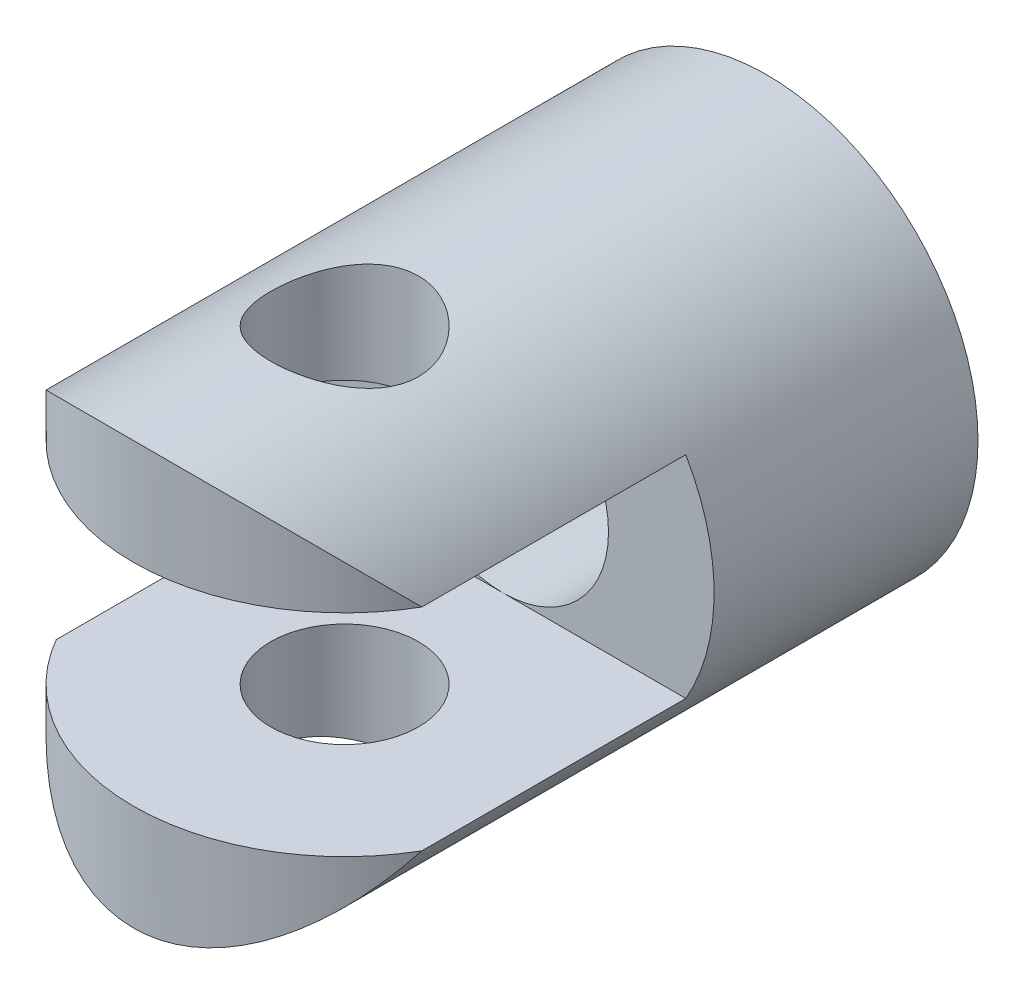
ISO-10303-21;
HEADER;
FILE_DESCRIPTION(('STEP AP214'),'2;1');
FILE_NAME('part.step','',(''),(''),'','','');
FILE_SCHEMA(('AUTOMOTIVE_DESIGN { 1 0 10303 214 1 1 1 1 }'));
ENDSEC;
DATA;
#1=APPLICATION_CONTEXT('core data for automotive mechanical design processes');
#2=APPLICATION_PROTOCOL_DEFINITION('international standard','automotive_design',2000,#1);
#3=PRODUCT_CONTEXT('',#1,'mechanical');
#4=PRODUCT('Part','Part','',(#3));
#5=PRODUCT_RELATED_PRODUCT_CATEGORY('part','',(#4));
#6=PRODUCT_DEFINITION_FORMATION('','',#4);
#7=PRODUCT_DEFINITION_CONTEXT('part definition',#1,'design');
#8=PRODUCT_DEFINITION('design','',#6,#7);
#9=PRODUCT_DEFINITION_SHAPE('','',#8);
#10=(LENGTH_UNIT() NAMED_UNIT(*) SI_UNIT(.MILLI.,.METRE.));
#11=(NAMED_UNIT(*) PLANE_ANGLE_UNIT() SI_UNIT($,.RADIAN.));
#12=(NAMED_UNIT(*) SI_UNIT($,.STERADIAN.) SOLID_ANGLE_UNIT());
#13=UNCERTAINTY_MEASURE_WITH_UNIT(LENGTH_MEASURE(1.E-05),#10,'distance_accuracy_value','');
#14=(GEOMETRIC_REPRESENTATION_CONTEXT(3) GLOBAL_UNCERTAINTY_ASSIGNED_CONTEXT((#13)) GLOBAL_UNIT_ASSIGNED_CONTEXT((#10,
#11,#12)) REPRESENTATION_CONTEXT('',''));
#15=CARTESIAN_POINT('',(0.,0.,0.));
#16=DIRECTION('',(0.,0.,1.));
#17=DIRECTION('',(1.,0.,0.));
#18=AXIS2_PLACEMENT_3D('',#15,#16,#17);
#19=CARTESIAN_POINT('',(0.,0.,60.));
#20=DIRECTION('',(0.,0.,-1.));
#21=DIRECTION('',(-1.,0.,0.));
#22=AXIS2_PLACEMENT_3D('',#19,#20,#21);
#23=CYLINDRICAL_SURFACE('',#22,10.);
#24=CARTESIAN_POINT('',(0.,0.,0.));
#25=DIRECTION('',(0.,0.,1.));
#26=DIRECTION('',(1.,0.,0.));
#27=AXIS2_PLACEMENT_3D('',#24,#25,#26);
#28=CIRCLE('',#27,10.);
#29=CARTESIAN_POINT('',(10.,0.,0.));
#30=VERTEX_POINT('',#29);
#31=EDGE_CURVE('E241',#30,#30,#28,.T.);
#32=ORIENTED_EDGE('',*,*,#31,.F.);
#33=EDGE_LOOP('',(#32));
#34=FACE_BOUND('',#33,.T.);
#35=CARTESIAN_POINT('',(0.,0.,25.));
#36=DIRECTION('',(0.,0.,1.));
#37=DIRECTION('',(1.,0.,0.));
#38=AXIS2_PLACEMENT_3D('',#35,#36,#37);
#39=CIRCLE('',#38,10.);
#40=CARTESIAN_POINT('',(0.,-10.,25.));
#41=VERTEX_POINT('',#40);
#42=CARTESIAN_POINT('',(0.,10.,25.));
#43=VERTEX_POINT('',#42);
#44=EDGE_CURVE('E123',#41,#43,#39,.T.);
#45=ORIENTED_EDGE('',*,*,#44,.T.);
#46=EDGE_CURVE('E12',#43,#41,#39,.T.);
#47=ORIENTED_EDGE('',*,*,#46,.T.);
#48=EDGE_LOOP('',(#45,#47));
#49=FACE_BOUND('',#48,.T.);
#50=ADVANCED_FACE('F118',(#34,#49),#23,.F.);
#51=CARTESIAN_POINT('',(0.,60.,40.));
#52=DIRECTION('',(0.,-1.,0.));
#53=DIRECTION('',(0.,0.,-1.));
#54=AXIS2_PLACEMENT_3D('',#51,#52,#53);
#55=CYLINDRICAL_SURFACE('',#54,20.);
#56=CARTESIAN_POINT('',(0.,0.,40.));
#57=DIRECTION('',(0.,0.707106781186547,-0.707106781186547));
#58=DIRECTION('',(0.,-0.707106781186547,-0.707106781186547));
#59=AXIS2_PLACEMENT_3D('',#56,#57,#58);
#60=ELLIPSE('',#59,28.2842712474619,20.);
#61=CARTESIAN_POINT('',(-17.3205080756888,10.,50.));
#62=VERTEX_POINT('',#61);
#63=CARTESIAN_POINT('',(17.3205080756888,10.,50.));
#64=VERTEX_POINT('',#63);
#65=EDGE_CURVE('E189',#62,#64,#60,.T.);
#66=ORIENTED_EDGE('',*,*,#65,.F.);
#67=CARTESIAN_POINT('',(0.,10.,40.));
#68=DIRECTION('',(0.,1.,0.));
#69=DIRECTION('',(0.,0.,1.));
#70=AXIS2_PLACEMENT_3D('',#67,#68,#69);
#71=CIRCLE('',#70,20.);
#72=EDGE_CURVE('E191',#62,#64,#71,.T.);
#73=ORIENTED_EDGE('',*,*,#72,.T.);
#74=EDGE_LOOP('',(#66,#73));
#75=FACE_BOUND('',#74,.T.);
#76=ADVANCED_FACE('F227',(#75),#55,.T.);
#77=CARTESIAN_POINT('',(0.,0.,60.));
#78=DIRECTION('',(0.,0.,-1.));
#79=DIRECTION('',(-1.,0.,0.));
#80=AXIS2_PLACEMENT_3D('',#77,#78,#79);
#81=CYLINDRICAL_SURFACE('',#80,20.);
#82=CARTESIAN_POINT('',(0.,0.,25.));
#83=DIRECTION('',(0.,0.,1.));
#84=DIRECTION('',(1.,0.,0.));
#85=AXIS2_PLACEMENT_3D('',#82,#83,#84);
#86=CIRCLE('',#85,20.);
#87=CARTESIAN_POINT('',(-17.3205080756888,10.,25.));
#88=VERTEX_POINT('',#87);
#89=CARTESIAN_POINT('',(-17.3205080756888,-10.,25.));
#90=VERTEX_POINT('',#89);
#91=EDGE_CURVE('E172',#88,#90,#86,.T.);
#92=ORIENTED_EDGE('',*,*,#91,.F.);
#93=DIRECTION('',(0.,0.,-1.));
#94=VECTOR('',#93,1.);
#95=CARTESIAN_POINT('',(-17.3205080756888,10.,60.));
#96=LINE('',#95,#94);
#97=EDGE_CURVE('E182',#88,#62,#96,.F.);
#98=ORIENTED_EDGE('',*,*,#97,.T.);
#99=ORIENTED_EDGE('',*,*,#65,.T.);
#100=DIRECTION('',(0.,0.,-1.));
#101=VECTOR('',#100,1.);
#102=CARTESIAN_POINT('',(17.3205080756888,10.,60.));
#103=LINE('',#102,#101);
#104=CARTESIAN_POINT('',(17.3205080756888,10.,25.));
#105=VERTEX_POINT('',#104);
#106=EDGE_CURVE('E177',#64,#105,#103,.T.);
#107=ORIENTED_EDGE('',*,*,#106,.T.);
#108=CARTESIAN_POINT('',(17.3205080756888,-10.,25.));
#109=VERTEX_POINT('',#108);
#110=EDGE_CURVE('E165',#109,#105,#86,.T.);
#111=ORIENTED_EDGE('',*,*,#110,.F.);
#112=DIRECTION('',(0.,0.,-1.));
#113=VECTOR('',#112,1.);
#114=CARTESIAN_POINT('',(17.3205080756888,-10.,60.));
#115=LINE('',#114,#113);
#116=CARTESIAN_POINT('',(17.3205080756888,-9.99999999999999,50.));
#117=VERTEX_POINT('',#116);
#118=EDGE_CURVE('E173',#109,#117,#115,.F.);
#119=ORIENTED_EDGE('',*,*,#118,.T.);
#120=CARTESIAN_POINT('',(0.,0.,40.));
#121=DIRECTION('',(0.,-0.707106781186547,-0.707106781186547));
#122=DIRECTION('',(0.,0.707106781186547,-0.707106781186547));
#123=AXIS2_PLACEMENT_3D('',#120,#121,#122);
#124=ELLIPSE('',#123,28.2842712474619,20.);
#125=CARTESIAN_POINT('',(-17.3205080756888,-9.99999999999999,50.));
#126=VERTEX_POINT('',#125);
#127=EDGE_CURVE('E242',#117,#126,#124,.T.);
#128=ORIENTED_EDGE('',*,*,#127,.T.);
#129=DIRECTION('',(0.,0.,-1.));
#130=VECTOR('',#129,1.);
#131=CARTESIAN_POINT('',(-17.3205080756888,-10.,60.));
#132=LINE('',#131,#130);
#133=EDGE_CURVE('E190',#126,#90,#132,.T.);
#134=ORIENTED_EDGE('',*,*,#133,.T.);
#135=EDGE_LOOP('',(#92,#98,#99,#107,#111,#119,#128,#134));
#136=FACE_BOUND('',#135,.T.);
#137=CARTESIAN_POINT('',(0.,0.,0.));
#138=DIRECTION('',(0.,0.,1.));
#139=DIRECTION('',(1.,0.,0.));
#140=AXIS2_PLACEMENT_3D('',#137,#138,#139);
#141=CIRCLE('',#140,20.);
#142=CARTESIAN_POINT('',(20.,0.,0.));
#143=VERTEX_POINT('',#142);
#144=EDGE_CURVE('E238',#143,#143,#141,.T.);
#145=ORIENTED_EDGE('',*,*,#144,.T.);
#146=EDGE_LOOP('',(#145));
#147=FACE_BOUND('',#146,.T.);
#148=CARTESIAN_POINT('',(0.,-20.,33.));
#149=CARTESIAN_POINT('',(0.190379510814174,-20.0000002557627,32.9999996347943));
#150=CARTESIAN_POINT('',(0.380753629824822,-19.997275598736,33.0077727486876));
#151=CARTESIAN_POINT('',(0.760150346015794,-19.9864503171989,33.0387926160325));
#152=CARTESIAN_POINT('',(0.949172452899204,-19.9783478333663,33.0620447211766));
#153=CARTESIAN_POINT('',(1.3243344911791,-19.9569894781986,33.1237898613887));
#154=CARTESIAN_POINT('',(1.51047552038497,-19.9437356226551,33.1622769349447));
#155=CARTESIAN_POINT('',(1.87870300702666,-19.9124241135389,33.2541495692637));
#156=CARTESIAN_POINT('',(2.06078787000741,-19.8943646057839,33.3075408809737));
#157=CARTESIAN_POINT('',(2.41920066489479,-19.853964954883,33.4286096442382));
#158=CARTESIAN_POINT('',(2.59554030818131,-19.831634252727,33.4962556204083));
#159=CARTESIAN_POINT('',(2.94181048322351,-19.7832334893252,33.6453717679986));
#160=CARTESIAN_POINT('',(3.11173873728697,-19.7571621146855,33.7268467968077));
#161=CARTESIAN_POINT('',(3.44408764171132,-19.7019450787699,33.9029818022025));
#162=CARTESIAN_POINT('',(3.60650839673439,-19.6727994603708,33.9976415949054));
#163=CARTESIAN_POINT('',(3.92291235571765,-19.6121572423463,34.1994848934097));
#164=CARTESIAN_POINT('',(4.07689519323237,-19.5806605407572,34.3066689424878));
#165=CARTESIAN_POINT('',(4.38066553186856,-19.514987476933,34.5367317777498));
#166=CARTESIAN_POINT('',(4.53012993459567,-19.4807563275013,34.660021680659));
#167=CARTESIAN_POINT('',(4.81818751228649,-19.4115174670758,34.9184160125357));
#168=CARTESIAN_POINT('',(4.95678397253778,-19.3765099948947,35.0535168448378));
#169=CARTESIAN_POINT('',(5.22241485365965,-19.3066117931527,35.3348281848138));
#170=CARTESIAN_POINT('',(5.34944244315052,-19.2717211441379,35.4810451642395));
#171=CARTESIAN_POINT('',(5.59101485936918,-19.2030289396764,35.783601722341));
#172=CARTESIAN_POINT('',(5.70556417629369,-19.1692269955732,35.9399376273125));
#173=CARTESIAN_POINT('',(5.92501960437596,-19.1025581064012,36.2671450106056));
#174=CARTESIAN_POINT('',(6.02948691981232,-19.0697580591834,36.4383248788369));
#175=CARTESIAN_POINT('',(6.22352422733065,-19.0073179555071,36.7893994449575));
#176=CARTESIAN_POINT('',(6.31309976970984,-18.9776767232153,36.969290863548));
#177=CARTESIAN_POINT('',(6.47664196817137,-18.9224882668945,37.336632716277));
#178=CARTESIAN_POINT('',(6.55060966207493,-18.8969407706858,37.5240826468353));
#179=CARTESIAN_POINT('',(6.6822524070392,-18.8507924256452,37.9052104646861));
#180=CARTESIAN_POINT('',(6.73992827609932,-18.8301913284665,38.0988880387496));
#181=CARTESIAN_POINT('',(6.83660181712854,-18.7953031425721,38.4838198681046));
#182=CARTESIAN_POINT('',(6.87620575891128,-18.780812588109,38.674903448853));
#183=CARTESIAN_POINT('',(6.93934913888391,-18.7575736702982,39.060048457505));
#184=CARTESIAN_POINT('',(6.9628894027597,-18.7488250118134,39.2541097318285));
#185=CARTESIAN_POINT('',(6.99365219395193,-18.7373717365703,39.6436440787834));
#186=CARTESIAN_POINT('',(7.00087938126763,-18.7346653937643,39.8391167322292));
#187=CARTESIAN_POINT('',(6.99895017132947,-18.7353862809268,40.2299665394653));
#188=CARTESIAN_POINT('',(6.98979430015313,-18.738813313946,40.4253436961205));
#189=CARTESIAN_POINT('',(6.95609024305096,-18.7513494764488,40.8044547154855));
#190=CARTESIAN_POINT('',(6.93235597276269,-18.7601580236465,40.9882716069833));
#191=CARTESIAN_POINT('',(6.87045272077842,-18.7829168660843,41.3531963455346));
#192=CARTESIAN_POINT('',(6.83227899348703,-18.7968688517013,41.5343032815841));
#193=CARTESIAN_POINT('',(6.74185751517092,-18.8294891709237,41.8924762627579));
#194=CARTESIAN_POINT('',(6.68961355280953,-18.8481562348255,42.0695433817738));
#195=CARTESIAN_POINT('',(6.5714698051527,-18.889671844908,42.4186264211257));
#196=CARTESIAN_POINT('',(6.50556481878602,-18.9125219832945,42.5906403890477));
#197=CARTESIAN_POINT('',(6.35940401760197,-18.9621737697556,42.9313688910888));
#198=CARTESIAN_POINT('',(6.27892478060483,-18.9890355977165,43.0999787490125));
#199=CARTESIAN_POINT('',(6.10496036962297,-19.0456773443778,43.4299055219081));
#200=CARTESIAN_POINT('',(6.0114707607999,-19.0754582570773,43.5912199251338));
#201=CARTESIAN_POINT('',(5.81212990683998,-19.1371374053669,43.9056105553202));
#202=CARTESIAN_POINT('',(5.70627759212364,-19.1690358240533,44.0586860678037));
#203=CARTESIAN_POINT('',(5.48287443967911,-19.2341265042172,44.3557584658207));
#204=CARTESIAN_POINT('',(5.36532314389779,-19.2673188163239,44.4997549955217));
#205=CARTESIAN_POINT('',(5.11204002825914,-19.3361125774096,44.7859855430747));
#206=CARTESIAN_POINT('',(4.97564839454307,-19.3717418459999,44.927629718284));
#207=CARTESIAN_POINT('',(4.69142066491873,-19.4425309902292,45.1989578511985));
#208=CARTESIAN_POINT('',(4.54358813813572,-19.4776910082754,45.3286455114391));
#209=CARTESIAN_POINT('',(4.2372573836588,-19.5466187476215,45.5753332087514));
#210=CARTESIAN_POINT('',(4.07875389718103,-19.5803857690185,45.692326914807));
#211=CARTESIAN_POINT('',(3.75218013604248,-19.6455810409374,45.9126923516178));
#212=CARTESIAN_POINT('',(3.58411369717063,-19.6770102176807,46.0160694897133));
#213=CARTESIAN_POINT('',(3.23727513609909,-19.7370565468099,46.2096681278277));
#214=CARTESIAN_POINT('',(3.0583961743888,-19.7656340354721,46.299710768677));
#215=CARTESIAN_POINT('',(2.69313954119571,-19.8187042427246,46.4642947515438));
#216=CARTESIAN_POINT('',(2.50676483778834,-19.8431985587353,46.5388421584439));
#217=CARTESIAN_POINT('',(2.12780769186428,-19.8874034694532,46.6717875567886));
#218=CARTESIAN_POINT('',(1.93522592559484,-19.9071145832985,46.7301873008932));
#219=CARTESIAN_POINT('',(1.54530299755591,-19.9411716836946,46.8302669103671));
#220=CARTESIAN_POINT('',(1.34796208044454,-19.9555179454183,46.8719476332927));
#221=CARTESIAN_POINT('',(0.959496383643001,-19.977873137968,46.9365905173578));
#222=CARTESIAN_POINT('',(0.768518346766548,-19.9861494304112,46.9603439322995));
#223=CARTESIAN_POINT('',(0.385098899552041,-19.9972116995573,46.9920453702269));
#224=CARTESIAN_POINT('',(0.192657541016102,-19.9999978697125,46.9999939501186));
#225=CARTESIAN_POINT('',(-0.192192700327045,-20.0000021275916,47.0000060421849));
#226=CARTESIAN_POINT('',(-0.384601583239493,-19.9972211364851,46.992072182345));
#227=CARTESIAN_POINT('',(-0.7679534838921,-19.9861706258114,46.9604049030065));
#228=CARTESIAN_POINT('',(-0.958896519122147,-19.9779011718335,46.9366716723168));
#229=CARTESIAN_POINT('',(-1.3316683351029,-19.9564618608745,46.874676996445));
#230=CARTESIAN_POINT('',(-1.51359068302967,-19.9434615638191,46.8369174032782));
#231=CARTESIAN_POINT('',(-1.8735565110311,-19.9128708551367,46.7471627602669));
#232=CARTESIAN_POINT('',(-2.05159868398093,-19.8952789218397,46.6951629909408));
#233=CARTESIAN_POINT('',(-2.40253785585496,-19.8559558728273,46.5773901804607));
#234=CARTESIAN_POINT('',(-2.5754362253772,-19.8342258713562,46.5116208465204));
#235=CARTESIAN_POINT('',(-2.91513759166331,-19.7871521860471,46.3667951727804));
#236=CARTESIAN_POINT('',(-3.08193825051104,-19.7618071340494,46.2877338004139));
#237=CARTESIAN_POINT('',(-3.41286300254037,-19.7073906935053,46.1145878363764));
#238=CARTESIAN_POINT('',(-3.5767896644834,-19.6782364562151,46.0201519925572));
#239=CARTESIAN_POINT('',(-3.89620281112954,-19.6174933813524,45.8185296682272));
#240=CARTESIAN_POINT('',(-4.05168636255027,-19.5859037067737,45.7113387971544));
#241=CARTESIAN_POINT('',(-4.3532932196157,-19.5210818358171,45.4849247860537));
#242=CARTESIAN_POINT('',(-4.49941541918864,-19.4878494461664,45.36570022848));
#243=CARTESIAN_POINT('',(-4.78146922474682,-19.4205709821663,45.115959002106));
#244=CARTESIAN_POINT('',(-4.9174005237951,-19.3865248833499,44.9854419934462));
#245=CARTESIAN_POINT('',(-5.18491063922772,-19.3167483094149,44.7069983390493));
#246=CARTESIAN_POINT('',(-5.31592164013138,-19.2810197310637,44.5585250414514));
#247=CARTESIAN_POINT('',(-5.56496698304129,-19.2106191372734,44.2509166419726));
#248=CARTESIAN_POINT('',(-5.68300556461626,-19.1759467793404,44.0917850508995));
#249=CARTESIAN_POINT('',(-5.90540014786279,-19.1086304424351,43.7637132177658));
#250=CARTESIAN_POINT('',(-6.00975001676295,-19.0759873760414,43.5947686278905));
#251=CARTESIAN_POINT('',(-6.20388580182628,-19.0137369612608,43.2482643326679));
#252=CARTESIAN_POINT('',(-6.29367781540813,-18.9841283438453,43.0707082748454));
#253=CARTESIAN_POINT('',(-6.45805539958992,-18.9288417326515,42.7079853509529));
#254=CARTESIAN_POINT('',(-6.53263338001114,-18.9031657023984,42.5228147411158));
#255=CARTESIAN_POINT('',(-6.66582355617985,-18.8566109720885,42.1463109278698));
#256=CARTESIAN_POINT('',(-6.72444230272776,-18.8357303042274,41.954980289146));
#257=CARTESIAN_POINT('',(-6.82516238922244,-18.7994688142807,41.5675490144217));
#258=CARTESIAN_POINT('',(-6.86726739094994,-18.7840867729891,41.3714494461442));
#259=CARTESIAN_POINT('',(-6.93452673635316,-18.7593611090636,40.9759914728701));
#260=CARTESIAN_POINT('',(-6.95968205586835,-18.7500171388027,40.7766332561598));
#261=CARTESIAN_POINT('',(-6.9918285689319,-18.7380523354435,40.3876173529524));
#262=CARTESIAN_POINT('',(-6.99976577558099,-18.7350814578298,40.1980480229726));
#263=CARTESIAN_POINT('',(-7.00022397844286,-18.734910361035,39.8188897274838));
#264=CARTESIAN_POINT('',(-6.99274537308215,-18.7377099927131,39.6293007626088));
#265=CARTESIAN_POINT('',(-6.96245026886038,-18.7489878425922,39.2515412525635));
#266=CARTESIAN_POINT('',(-6.93963498778951,-18.7574656099273,39.0633705959736));
#267=CARTESIAN_POINT('',(-6.87889650708428,-18.779825013243,38.6898122496523));
#268=CARTESIAN_POINT('',(-6.84097327774538,-18.7937066598485,38.5044245653934));
#269=CARTESIAN_POINT('',(-6.75144202949666,-18.8260520802409,38.1420302328985));
#270=CARTESIAN_POINT('',(-6.70017451296872,-18.8444011960042,37.9649289701881));
#271=CARTESIAN_POINT('',(-6.58399463241982,-18.8853065966517,37.6156988887565));
#272=CARTESIAN_POINT('',(-6.51907774271501,-18.9078642766774,37.4435717408732));
#273=CARTESIAN_POINT('',(-6.37613257990897,-18.9565458047153,37.1054145243517));
#274=CARTESIAN_POINT('',(-6.29810654023132,-18.9826690451162,36.9393834229834));
#275=CARTESIAN_POINT('',(-6.12946643507451,-19.0377916299466,36.614266450762));
#276=CARTESIAN_POINT('',(-6.03884758544594,-19.0667920662515,36.4551832498257));
#277=CARTESIAN_POINT('',(-5.84110712010737,-19.1283214740436,36.1376074593731));
#278=CARTESIAN_POINT('',(-5.73341106637915,-19.1609521223922,35.9794920728845));
#279=CARTESIAN_POINT('',(-5.50557358977448,-19.22765587399,35.6727403270379));
#280=CARTESIAN_POINT('',(-5.3854278330094,-19.2617294770913,35.5241072978882));
#281=CARTESIAN_POINT('',(-5.13344625382982,-19.3304107582593,35.2372083831486));
#282=CARTESIAN_POINT('',(-5.00160917942757,-19.365018493196,35.098943610797));
#283=CARTESIAN_POINT('',(-4.72702903768717,-19.4338680686943,34.8336039586955));
#284=CARTESIAN_POINT('',(-4.58428584783112,-19.4681099051407,34.7065292046875));
#285=CARTESIAN_POINT('',(-4.2820667188769,-19.5368620577359,34.4589027169383));
#286=CARTESIAN_POINT('',(-4.12212725127441,-19.5713153969098,34.3389000496895));
#287=CARTESIAN_POINT('',(-3.7922939967703,-19.6378918931676,34.1128560875575));
#288=CARTESIAN_POINT('',(-3.62240374498974,-19.6700158688141,34.0068098774488));
#289=CARTESIAN_POINT('',(-3.27365840865087,-19.7310542535635,33.8094170297185));
#290=CARTESIAN_POINT('',(-3.09480052069902,-19.7599676498042,33.7180750268644));
#291=CARTESIAN_POINT('',(-2.72946319905269,-19.8137351354526,33.5509410310783));
#292=CARTESIAN_POINT('',(-2.5429871504396,-19.8385910037887,33.4751422198429));
#293=CARTESIAN_POINT('',(-2.16565271416757,-19.8833011293674,33.340445960451));
#294=CARTESIAN_POINT('',(-1.97485999273244,-19.903204671866,33.2813810837593));
#295=CARTESIAN_POINT('',(-1.58855268512657,-19.9377552826724,33.1797086906492));
#296=CARTESIAN_POINT('',(-1.39304011356965,-19.9524045528002,33.137094280037));
#297=CARTESIAN_POINT('',(-0.9987640194409,-19.9760223260487,33.0687303915026));
#298=CARTESIAN_POINT('',(-0.800000779181308,-19.9849913198275,33.0429794569191));
#299=CARTESIAN_POINT('',(-0.400822987298904,-19.9969798957399,33.0086148176145));
#300=CARTESIAN_POINT('',(-0.20040850623174,-19.999999730764,33.0000003844443));
#301=CARTESIAN_POINT('',(0.,-20.,33.));
#302=B_SPLINE_CURVE_WITH_KNOTS('',3,(#148,#149,#150,#151,#152,#153,#154,#155,#156,#157,#158,
#159,#160,#161,#162,#163,#164,#165,#166,#167,#168,#169,#170,#171,#172,#173,#174,#175,#176,#177,
#178,#179,#180,#181,#182,#183,#184,#185,#186,#187,#188,#189,#190,#191,#192,#193,#194,#195,#196,
#197,#198,#199,#200,#201,#202,#203,#204,#205,#206,#207,#208,#209,#210,#211,#212,#213,#214,#215,
#216,#217,#218,#219,#220,#221,#222,#223,#224,#225,#226,#227,#228,#229,#230,#231,#232,#233,#234,
#235,#236,#237,#238,#239,#240,#241,#242,#243,#244,#245,#246,#247,#248,#249,#250,#251,#252,#253,
#254,#255,#256,#257,#258,#259,#260,#261,#262,#263,#264,#265,#266,#267,#268,#269,#270,#271,#272,
#273,#274,#275,#276,#277,#278,#279,#280,#281,#282,#283,#284,#285,#286,#287,#288,#289,#290,#291,
#292,#293,#294,#295,#296,#297,#298,#299,#300,#301),.UNSPECIFIED.,.T.,.F.,(4,2,2,2,2,2,2,2,2,2,2,
2,2,2,2,2,2,2,2,2,2,2,2,2,2,2,2,2,2,2,2,2,2,2,2,2,2,2,2,2,2,2,2,2,2,2,2,2,2,2,2,2,2,2,2,2,2,2,2,
2,2,2,2,2,2,2,2,2,2,2,2,2,2,2,2,2,4),(0.,0.570952011570335,1.14210152616462,1.71302776795153,
2.28417461247942,2.85407329397687,3.42417256548522,3.99426388682975,4.56437994675292,
5.15397513312463,5.74339139718472,6.33315348302534,6.92270264220565,7.5315636426302,
8.14019720387367,8.74879028215023,9.35735279802471,9.94364579493683,10.5299086536494,
11.1160040190991,11.7020805647382,12.2580844046936,12.8142711369192,13.3703082553615,
13.9265574602489,14.4921942614766,15.0580243454442,15.623903419431,16.189804658145,
16.7886264878137,17.3872622550034,17.9861952281138,18.5848896343728,19.1910015280626,
19.7968757390919,20.4026841629752,21.0084615096053,21.5856217549355,22.1627616628328,
22.739806082251,23.3168436058799,23.8749617096897,24.4332650094245,24.9914181886458,
25.5497831709823,26.1233937031654,26.6972022590634,27.2710784875997,27.8449719936192,
28.4478901456453,29.0506106658986,29.6536002994237,30.2563367203786,30.8593731110378,
31.462161598356,32.0648163468452,32.6674363958904,33.2360067581772,33.8045624257685,
34.3730729532163,34.9415845984484,35.496810979221,36.0522217459552,36.6075379823848,
37.1630657693863,37.74463284894,38.3264030633513,38.9082356531763,39.4900747801953,
40.0980384485733,40.7057874262754,41.3137275930046,41.9214005025211,42.5227594520662,
43.1238661049481,43.7249208275989,44.3259499996956),.UNSPECIFIED.);
#303=CARTESIAN_POINT('',(0.,-20.,33.));
#304=VERTEX_POINT('',#303);
#305=EDGE_CURVE('E200',#304,#304,#302,.T.);
#306=ORIENTED_EDGE('',*,*,#305,.F.);
#307=EDGE_LOOP('',(#306));
#308=FACE_BOUND('',#307,.T.);
#309=CARTESIAN_POINT('',(0.,20.,33.));
#310=CARTESIAN_POINT('',(-0.190379510814174,20.0000002557627,32.9999996347943));
#311=CARTESIAN_POINT('',(-0.380753629824822,19.997275598736,33.0077727486876));
#312=CARTESIAN_POINT('',(-0.760150346015794,19.9864503171989,33.0387926160325));
#313=CARTESIAN_POINT('',(-0.949172452899204,19.9783478333663,33.0620447211766));
#314=CARTESIAN_POINT('',(-1.3243344911791,19.9569894781986,33.1237898613887));
#315=CARTESIAN_POINT('',(-1.51047552038497,19.9437356226551,33.1622769349447));
#316=CARTESIAN_POINT('',(-1.87870300702666,19.9124241135389,33.2541495692637));
#317=CARTESIAN_POINT('',(-2.06078787000741,19.8943646057839,33.3075408809737));
#318=CARTESIAN_POINT('',(-2.41920066489479,19.853964954883,33.4286096442382));
#319=CARTESIAN_POINT('',(-2.59554030818131,19.831634252727,33.4962556204083));
#320=CARTESIAN_POINT('',(-2.94181048322351,19.7832334893252,33.6453717679986));
#321=CARTESIAN_POINT('',(-3.11173873728697,19.7571621146855,33.7268467968077));
#322=CARTESIAN_POINT('',(-3.44408764171132,19.7019450787699,33.9029818022025));
#323=CARTESIAN_POINT('',(-3.60650839673439,19.6727994603708,33.9976415949054));
#324=CARTESIAN_POINT('',(-3.92291235571765,19.6121572423463,34.1994848934097));
#325=CARTESIAN_POINT('',(-4.07689519323237,19.5806605407572,34.3066689424878));
#326=CARTESIAN_POINT('',(-4.38066553186856,19.514987476933,34.5367317777498));
#327=CARTESIAN_POINT('',(-4.53012993459567,19.4807563275013,34.660021680659));
#328=CARTESIAN_POINT('',(-4.81818751228649,19.4115174670758,34.9184160125357));
#329=CARTESIAN_POINT('',(-4.95678397253778,19.3765099948947,35.0535168448378));
#330=CARTESIAN_POINT('',(-5.22241485365965,19.3066117931527,35.3348281848138));
#331=CARTESIAN_POINT('',(-5.34944244315052,19.2717211441379,35.4810451642395));
#332=CARTESIAN_POINT('',(-5.59101485936918,19.2030289396764,35.783601722341));
#333=CARTESIAN_POINT('',(-5.70556417629369,19.1692269955732,35.9399376273125));
#334=CARTESIAN_POINT('',(-5.92501960437596,19.1025581064012,36.2671450106056));
#335=CARTESIAN_POINT('',(-6.02948691981232,19.0697580591834,36.4383248788369));
#336=CARTESIAN_POINT('',(-6.22352422733065,19.0073179555071,36.7893994449575));
#337=CARTESIAN_POINT('',(-6.31309976970984,18.9776767232153,36.969290863548));
#338=CARTESIAN_POINT('',(-6.47664196817137,18.9224882668945,37.336632716277));
#339=CARTESIAN_POINT('',(-6.55060966207493,18.8969407706858,37.5240826468353));
#340=CARTESIAN_POINT('',(-6.6822524070392,18.8507924256452,37.9052104646861));
#341=CARTESIAN_POINT('',(-6.73992827609932,18.8301913284665,38.0988880387496));
#342=CARTESIAN_POINT('',(-6.83660181712854,18.7953031425721,38.4838198681046));
#343=CARTESIAN_POINT('',(-6.87620575891128,18.780812588109,38.674903448853));
#344=CARTESIAN_POINT('',(-6.93934913888391,18.7575736702982,39.060048457505));
#345=CARTESIAN_POINT('',(-6.9628894027597,18.7488250118134,39.2541097318285));
#346=CARTESIAN_POINT('',(-6.99365219395193,18.7373717365703,39.6436440787834));
#347=CARTESIAN_POINT('',(-7.00087938126763,18.7346653937643,39.8391167322292));
#348=CARTESIAN_POINT('',(-6.99895017132947,18.7353862809268,40.2299665394653));
#349=CARTESIAN_POINT('',(-6.98979430015313,18.738813313946,40.4253436961205));
#350=CARTESIAN_POINT('',(-6.95609024305096,18.7513494764488,40.8044547154855));
#351=CARTESIAN_POINT('',(-6.93235597276269,18.7601580236465,40.9882716069833));
#352=CARTESIAN_POINT('',(-6.87045272077842,18.7829168660843,41.3531963455346));
#353=CARTESIAN_POINT('',(-6.83227899348703,18.7968688517013,41.5343032815841));
#354=CARTESIAN_POINT('',(-6.74185751517092,18.8294891709237,41.8924762627579));
#355=CARTESIAN_POINT('',(-6.68961355280953,18.8481562348255,42.0695433817738));
#356=CARTESIAN_POINT('',(-6.5714698051527,18.889671844908,42.4186264211257));
#357=CARTESIAN_POINT('',(-6.50556481878602,18.9125219832945,42.5906403890477));
#358=CARTESIAN_POINT('',(-6.35940401760197,18.9621737697556,42.9313688910888));
#359=CARTESIAN_POINT('',(-6.27892478060483,18.9890355977165,43.0999787490125));
#360=CARTESIAN_POINT('',(-6.10496036962297,19.0456773443778,43.4299055219081));
#361=CARTESIAN_POINT('',(-6.0114707607999,19.0754582570773,43.5912199251338));
#362=CARTESIAN_POINT('',(-5.81212990683998,19.1371374053669,43.9056105553202));
#363=CARTESIAN_POINT('',(-5.70627759212364,19.1690358240533,44.0586860678037));
#364=CARTESIAN_POINT('',(-5.48287443967911,19.2341265042172,44.3557584658207));
#365=CARTESIAN_POINT('',(-5.36532314389779,19.2673188163239,44.4997549955217));
#366=CARTESIAN_POINT('',(-5.11204002825914,19.3361125774096,44.7859855430747));
#367=CARTESIAN_POINT('',(-4.97564839454307,19.3717418459999,44.927629718284));
#368=CARTESIAN_POINT('',(-4.69142066491873,19.4425309902292,45.1989578511985));
#369=CARTESIAN_POINT('',(-4.54358813813572,19.4776910082754,45.3286455114391));
#370=CARTESIAN_POINT('',(-4.2372573836588,19.5466187476215,45.5753332087514));
#371=CARTESIAN_POINT('',(-4.07875389718103,19.5803857690185,45.692326914807));
#372=CARTESIAN_POINT('',(-3.75218013604248,19.6455810409374,45.9126923516178));
#373=CARTESIAN_POINT('',(-3.58411369717063,19.6770102176807,46.0160694897133));
#374=CARTESIAN_POINT('',(-3.23727513609909,19.7370565468099,46.2096681278277));
#375=CARTESIAN_POINT('',(-3.0583961743888,19.7656340354721,46.299710768677));
#376=CARTESIAN_POINT('',(-2.69313954119571,19.8187042427246,46.4642947515438));
#377=CARTESIAN_POINT('',(-2.50676483778834,19.8431985587353,46.5388421584439));
#378=CARTESIAN_POINT('',(-2.12780769186428,19.8874034694532,46.6717875567886));
#379=CARTESIAN_POINT('',(-1.93522592559484,19.9071145832985,46.7301873008932));
#380=CARTESIAN_POINT('',(-1.54530299755591,19.9411716836946,46.8302669103671));
#381=CARTESIAN_POINT('',(-1.34796208044454,19.9555179454183,46.8719476332927));
#382=CARTESIAN_POINT('',(-0.959496383643001,19.977873137968,46.9365905173578));
#383=CARTESIAN_POINT('',(-0.768518346766548,19.9861494304112,46.9603439322995));
#384=CARTESIAN_POINT('',(-0.385098899552041,19.9972116995573,46.9920453702269));
#385=CARTESIAN_POINT('',(-0.192657541016102,19.9999978697125,46.9999939501186));
#386=CARTESIAN_POINT('',(0.192192700327045,20.0000021275916,47.0000060421849));
#387=CARTESIAN_POINT('',(0.384601583239493,19.9972211364851,46.992072182345));
#388=CARTESIAN_POINT('',(0.7679534838921,19.9861706258114,46.9604049030065));
#389=CARTESIAN_POINT('',(0.958896519122147,19.9779011718335,46.9366716723168));
#390=CARTESIAN_POINT('',(1.3316683351029,19.9564618608745,46.874676996445));
#391=CARTESIAN_POINT('',(1.51359068302967,19.9434615638191,46.8369174032782));
#392=CARTESIAN_POINT('',(1.8735565110311,19.9128708551367,46.7471627602669));
#393=CARTESIAN_POINT('',(2.05159868398093,19.8952789218397,46.6951629909408));
#394=CARTESIAN_POINT('',(2.40253785585496,19.8559558728273,46.5773901804607));
#395=CARTESIAN_POINT('',(2.5754362253772,19.8342258713562,46.5116208465204));
#396=CARTESIAN_POINT('',(2.91513759166331,19.7871521860471,46.3667951727804));
#397=CARTESIAN_POINT('',(3.08193825051104,19.7618071340494,46.2877338004139));
#398=CARTESIAN_POINT('',(3.41286300254037,19.7073906935053,46.1145878363764));
#399=CARTESIAN_POINT('',(3.5767896644834,19.6782364562151,46.0201519925572));
#400=CARTESIAN_POINT('',(3.89620281112954,19.6174933813524,45.8185296682272));
#401=CARTESIAN_POINT('',(4.05168636255027,19.5859037067737,45.7113387971544));
#402=CARTESIAN_POINT('',(4.3532932196157,19.5210818358171,45.4849247860537));
#403=CARTESIAN_POINT('',(4.49941541918864,19.4878494461664,45.36570022848));
#404=CARTESIAN_POINT('',(4.78146922474682,19.4205709821663,45.115959002106));
#405=CARTESIAN_POINT('',(4.9174005237951,19.3865248833499,44.9854419934462));
#406=CARTESIAN_POINT('',(5.18491063922772,19.3167483094149,44.7069983390493));
#407=CARTESIAN_POINT('',(5.31592164013138,19.2810197310637,44.5585250414514));
#408=CARTESIAN_POINT('',(5.56496698304129,19.2106191372734,44.2509166419726));
#409=CARTESIAN_POINT('',(5.68300556461626,19.1759467793404,44.0917850508995));
#410=CARTESIAN_POINT('',(5.90540014786279,19.1086304424351,43.7637132177658));
#411=CARTESIAN_POINT('',(6.00975001676295,19.0759873760414,43.5947686278905));
#412=CARTESIAN_POINT('',(6.20388580182628,19.0137369612608,43.2482643326679));
#413=CARTESIAN_POINT('',(6.29367781540813,18.9841283438453,43.0707082748454));
#414=CARTESIAN_POINT('',(6.45805539958992,18.9288417326515,42.7079853509529));
#415=CARTESIAN_POINT('',(6.53263338001114,18.9031657023984,42.5228147411158));
#416=CARTESIAN_POINT('',(6.66582355617985,18.8566109720885,42.1463109278698));
#417=CARTESIAN_POINT('',(6.72444230272776,18.8357303042274,41.954980289146));
#418=CARTESIAN_POINT('',(6.82516238922244,18.7994688142807,41.5675490144217));
#419=CARTESIAN_POINT('',(6.86726739094994,18.7840867729891,41.3714494461442));
#420=CARTESIAN_POINT('',(6.93452673635316,18.7593611090636,40.9759914728701));
#421=CARTESIAN_POINT('',(6.95968205586835,18.7500171388027,40.7766332561598));
#422=CARTESIAN_POINT('',(6.9918285689319,18.7380523354435,40.3876173529524));
#423=CARTESIAN_POINT('',(6.99976577558099,18.7350814578298,40.1980480229726));
#424=CARTESIAN_POINT('',(7.00022397844286,18.734910361035,39.8188897274838));
#425=CARTESIAN_POINT('',(6.99274537308215,18.7377099927131,39.6293007626088));
#426=CARTESIAN_POINT('',(6.96245026886038,18.7489878425922,39.2515412525635));
#427=CARTESIAN_POINT('',(6.93963498778951,18.7574656099273,39.0633705959736));
#428=CARTESIAN_POINT('',(6.87889650708428,18.779825013243,38.6898122496523));
#429=CARTESIAN_POINT('',(6.84097327774538,18.7937066598485,38.5044245653934));
#430=CARTESIAN_POINT('',(6.75144202949666,18.8260520802409,38.1420302328985));
#431=CARTESIAN_POINT('',(6.70017451296872,18.8444011960042,37.9649289701881));
#432=CARTESIAN_POINT('',(6.58399463241982,18.8853065966517,37.6156988887565));
#433=CARTESIAN_POINT('',(6.51907774271501,18.9078642766774,37.4435717408732));
#434=CARTESIAN_POINT('',(6.37613257990897,18.9565458047153,37.1054145243517));
#435=CARTESIAN_POINT('',(6.29810654023132,18.9826690451162,36.9393834229834));
#436=CARTESIAN_POINT('',(6.12946643507451,19.0377916299466,36.614266450762));
#437=CARTESIAN_POINT('',(6.03884758544594,19.0667920662515,36.4551832498257));
#438=CARTESIAN_POINT('',(5.84110712010737,19.1283214740436,36.1376074593731));
#439=CARTESIAN_POINT('',(5.73341106637915,19.1609521223922,35.9794920728845));
#440=CARTESIAN_POINT('',(5.50557358977448,19.22765587399,35.6727403270379));
#441=CARTESIAN_POINT('',(5.3854278330094,19.2617294770913,35.5241072978882));
#442=CARTESIAN_POINT('',(5.13344625382982,19.3304107582593,35.2372083831486));
#443=CARTESIAN_POINT('',(5.00160917942757,19.365018493196,35.098943610797));
#444=CARTESIAN_POINT('',(4.72702903768717,19.4338680686943,34.8336039586955));
#445=CARTESIAN_POINT('',(4.58428584783112,19.4681099051407,34.7065292046875));
#446=CARTESIAN_POINT('',(4.2820667188769,19.5368620577359,34.4589027169383));
#447=CARTESIAN_POINT('',(4.12212725127441,19.5713153969098,34.3389000496895));
#448=CARTESIAN_POINT('',(3.7922939967703,19.6378918931676,34.1128560875575));
#449=CARTESIAN_POINT('',(3.62240374498974,19.6700158688141,34.0068098774488));
#450=CARTESIAN_POINT('',(3.27365840865087,19.7310542535635,33.8094170297185));
#451=CARTESIAN_POINT('',(3.09480052069902,19.7599676498042,33.7180750268644));
#452=CARTESIAN_POINT('',(2.72946319905269,19.8137351354526,33.5509410310783));
#453=CARTESIAN_POINT('',(2.5429871504396,19.8385910037887,33.4751422198429));
#454=CARTESIAN_POINT('',(2.16565271416757,19.8833011293674,33.340445960451));
#455=CARTESIAN_POINT('',(1.97485999273244,19.903204671866,33.2813810837593));
#456=CARTESIAN_POINT('',(1.58855268512657,19.9377552826724,33.1797086906492));
#457=CARTESIAN_POINT('',(1.39304011356965,19.9524045528002,33.137094280037));
#458=CARTESIAN_POINT('',(0.9987640194409,19.9760223260487,33.0687303915026));
#459=CARTESIAN_POINT('',(0.800000779181308,19.9849913198275,33.0429794569191));
#460=CARTESIAN_POINT('',(0.400822987298904,19.9969798957399,33.0086148176145));
#461=CARTESIAN_POINT('',(0.20040850623174,19.999999730764,33.0000003844443));
#462=CARTESIAN_POINT('',(0.,20.,33.));
#463=B_SPLINE_CURVE_WITH_KNOTS('',3,(#309,#310,#311,#312,#313,#314,#315,#316,#317,#318,#319,
#320,#321,#322,#323,#324,#325,#326,#327,#328,#329,#330,#331,#332,#333,#334,#335,#336,#337,#338,
#339,#340,#341,#342,#343,#344,#345,#346,#347,#348,#349,#350,#351,#352,#353,#354,#355,#356,#357,
#358,#359,#360,#361,#362,#363,#364,#365,#366,#367,#368,#369,#370,#371,#372,#373,#374,#375,#376,
#377,#378,#379,#380,#381,#382,#383,#384,#385,#386,#387,#388,#389,#390,#391,#392,#393,#394,#395,
#396,#397,#398,#399,#400,#401,#402,#403,#404,#405,#406,#407,#408,#409,#410,#411,#412,#413,#414,
#415,#416,#417,#418,#419,#420,#421,#422,#423,#424,#425,#426,#427,#428,#429,#430,#431,#432,#433,
#434,#435,#436,#437,#438,#439,#440,#441,#442,#443,#444,#445,#446,#447,#448,#449,#450,#451,#452,
#453,#454,#455,#456,#457,#458,#459,#460,#461,#462),.UNSPECIFIED.,.T.,.F.,(4,2,2,2,2,2,2,2,2,2,2,
2,2,2,2,2,2,2,2,2,2,2,2,2,2,2,2,2,2,2,2,2,2,2,2,2,2,2,2,2,2,2,2,2,2,2,2,2,2,2,2,2,2,2,2,2,2,2,2,
2,2,2,2,2,2,2,2,2,2,2,2,2,2,2,2,2,4),(0.,0.570952011570335,1.14210152616462,1.71302776795153,
2.28417461247942,2.85407329397687,3.42417256548522,3.99426388682975,4.56437994675292,
5.15397513312463,5.74339139718472,6.33315348302534,6.92270264220565,7.5315636426302,
8.14019720387367,8.74879028215023,9.35735279802471,9.94364579493683,10.5299086536494,
11.1160040190991,11.7020805647382,12.2580844046936,12.8142711369192,13.3703082553615,
13.9265574602489,14.4921942614766,15.0580243454442,15.623903419431,16.189804658145,
16.7886264878137,17.3872622550034,17.9861952281138,18.5848896343728,19.1910015280626,
19.7968757390919,20.4026841629752,21.0084615096053,21.5856217549355,22.1627616628328,
22.739806082251,23.3168436058799,23.8749617096897,24.4332650094245,24.9914181886458,
25.5497831709823,26.1233937031654,26.6972022590634,27.2710784875997,27.8449719936192,
28.4478901456453,29.0506106658986,29.6536002994237,30.2563367203786,30.8593731110378,
31.462161598356,32.0648163468452,32.6674363958904,33.2360067581772,33.8045624257685,
34.3730729532163,34.9415845984484,35.496810979221,36.0522217459552,36.6075379823848,
37.1630657693863,37.74463284894,38.3264030633513,38.9082356531763,39.4900747801953,
40.0980384485733,40.7057874262754,41.3137275930046,41.9214005025211,42.5227594520662,
43.1238661049481,43.7249208275989,44.3259499996956),.UNSPECIFIED.);
#464=CARTESIAN_POINT('',(0.,20.,33.));
#465=VERTEX_POINT('',#464);
#466=EDGE_CURVE('E207',#465,#465,#463,.T.);
#467=ORIENTED_EDGE('',*,*,#466,.F.);
#468=EDGE_LOOP('',(#467));
#469=FACE_BOUND('',#468,.T.);
#470=ADVANCED_FACE('F120',(#136,#147,#308,#469),#81,.T.);
#471=CARTESIAN_POINT('',(0.,0.,0.));
#472=DIRECTION('',(0.,0.,1.));
#473=DIRECTION('',(1.,0.,0.));
#474=AXIS2_PLACEMENT_3D('',#471,#472,#473);
#475=PLANE('',#474);
#476=ORIENTED_EDGE('',*,*,#144,.F.);
#477=EDGE_LOOP('',(#476));
#478=FACE_BOUND('',#477,.T.);
#479=ORIENTED_EDGE('',*,*,#31,.T.);
#480=EDGE_LOOP('',(#479));
#481=FACE_BOUND('',#480,.T.);
#482=ADVANCED_FACE('F226',(#478,#481),#475,.F.);
#483=ORIENTED_EDGE('',*,*,#127,.F.);
#484=CARTESIAN_POINT('',(0.,-9.99999999999999,40.));
#485=DIRECTION('',(0.,-1.,0.));
#486=DIRECTION('',(0.,0.,-1.));
#487=AXIS2_PLACEMENT_3D('',#484,#485,#486);
#488=CIRCLE('',#487,20.);
#489=EDGE_CURVE('E141',#117,#126,#488,.T.);
#490=ORIENTED_EDGE('',*,*,#489,.T.);
#491=EDGE_LOOP('',(#483,#490));
#492=FACE_BOUND('',#491,.T.);
#493=ADVANCED_FACE('F222',(#492),#55,.T.);
#494=CARTESIAN_POINT('',(0.,60.,40.));
#495=DIRECTION('',(0.,-1.,0.));
#496=DIRECTION('',(0.,0.,-1.));
#497=AXIS2_PLACEMENT_3D('',#494,#495,#496);
#498=CYLINDRICAL_SURFACE('',#497,7.);
#499=CARTESIAN_POINT('',(0.,-9.99999999999999,40.));
#500=DIRECTION('',(0.,-1.,0.));
#501=DIRECTION('',(0.,0.,-1.));
#502=AXIS2_PLACEMENT_3D('',#499,#500,#501);
#503=CIRCLE('',#502,7.);
#504=CARTESIAN_POINT('',(0.,-9.99999999999999,33.));
#505=VERTEX_POINT('',#504);
#506=EDGE_CURVE('E250',#505,#505,#503,.T.);
#507=ORIENTED_EDGE('',*,*,#506,.F.);
#508=EDGE_LOOP('',(#507));
#509=FACE_BOUND('',#508,.T.);
#510=ORIENTED_EDGE('',*,*,#305,.T.);
#511=EDGE_LOOP('',(#510));
#512=FACE_BOUND('',#511,.T.);
#513=ADVANCED_FACE('F218',(#509,#512),#498,.F.);
#514=CARTESIAN_POINT('',(0.,10.,40.));
#515=DIRECTION('',(0.,1.,0.));
#516=DIRECTION('',(0.,0.,1.));
#517=AXIS2_PLACEMENT_3D('',#514,#515,#516);
#518=CIRCLE('',#517,7.);
#519=CARTESIAN_POINT('',(0.,10.,47.));
#520=VERTEX_POINT('',#519);
#521=EDGE_CURVE('E244',#520,#520,#518,.T.);
#522=ORIENTED_EDGE('',*,*,#521,.F.);
#523=EDGE_LOOP('',(#522));
#524=FACE_BOUND('',#523,.T.);
#525=ORIENTED_EDGE('',*,*,#466,.T.);
#526=EDGE_LOOP('',(#525));
#527=FACE_BOUND('',#526,.T.);
#528=ADVANCED_FACE('F212',(#524,#527),#498,.F.);
#529=CARTESIAN_POINT('',(0.,0.,25.));
#530=DIRECTION('',(0.,0.,1.));
#531=DIRECTION('',(1.,0.,0.));
#532=AXIS2_PLACEMENT_3D('',#529,#530,#531);
#533=PLANE('',#532);
#534=ORIENTED_EDGE('',*,*,#91,.T.);
#535=DIRECTION('',(1.,0.,0.));
#536=VECTOR('',#535,1.);
#537=CARTESIAN_POINT('',(21.6944751649917,-10.,25.));
#538=LINE('',#537,#536);
#539=EDGE_CURVE('E259',#90,#41,#538,.T.);
#540=ORIENTED_EDGE('',*,*,#539,.T.);
#541=ORIENTED_EDGE('',*,*,#46,.F.);
#542=DIRECTION('',(-1.,0.,0.));
#543=VECTOR('',#542,1.);
#544=CARTESIAN_POINT('',(21.6944751649917,10.,25.));
#545=LINE('',#544,#543);
#546=EDGE_CURVE('E180',#43,#88,#545,.T.);
#547=ORIENTED_EDGE('',*,*,#546,.T.);
#548=EDGE_LOOP('',(#534,#540,#541,#547));
#549=FACE_BOUND('',#548,.T.);
#550=ADVANCED_FACE('F217',(#549),#533,.T.);
#551=ORIENTED_EDGE('',*,*,#110,.T.);
#552=EDGE_CURVE('E134',#105,#43,#545,.T.);
#553=ORIENTED_EDGE('',*,*,#552,.T.);
#554=ORIENTED_EDGE('',*,*,#44,.F.);
#555=EDGE_CURVE('E168',#41,#109,#538,.T.);
#556=ORIENTED_EDGE('',*,*,#555,.T.);
#557=EDGE_LOOP('',(#551,#553,#554,#556));
#558=FACE_BOUND('',#557,.T.);
#559=ADVANCED_FACE('F166',(#558),#533,.T.);
#560=CARTESIAN_POINT('',(21.6944751649917,-10.,25.));
#561=DIRECTION('',(0.,-1.,0.));
#562=DIRECTION('',(0.,0.,-1.));
#563=AXIS2_PLACEMENT_3D('',#560,#561,#562);
#564=PLANE('',#563);
#565=ORIENTED_EDGE('',*,*,#506,.T.);
#566=EDGE_LOOP('',(#565));
#567=FACE_BOUND('',#566,.T.);
#568=ORIENTED_EDGE('',*,*,#555,.F.);
#569=ORIENTED_EDGE('',*,*,#539,.F.);
#570=ORIENTED_EDGE('',*,*,#133,.F.);
#571=ORIENTED_EDGE('',*,*,#489,.F.);
#572=ORIENTED_EDGE('',*,*,#118,.F.);
#573=EDGE_LOOP('',(#568,#569,#570,#571,#572));
#574=FACE_BOUND('',#573,.T.);
#575=ADVANCED_FACE('F220',(#567,#574),#564,.F.);
#576=CARTESIAN_POINT('',(21.6944751649917,10.,25.));
#577=DIRECTION('',(0.,1.,0.));
#578=DIRECTION('',(0.,0.,1.));
#579=AXIS2_PLACEMENT_3D('',#576,#577,#578);
#580=PLANE('',#579);
#581=ORIENTED_EDGE('',*,*,#521,.T.);
#582=EDGE_LOOP('',(#581));
#583=FACE_BOUND('',#582,.T.);
#584=ORIENTED_EDGE('',*,*,#72,.F.);
#585=ORIENTED_EDGE('',*,*,#97,.F.);
#586=ORIENTED_EDGE('',*,*,#546,.F.);
#587=ORIENTED_EDGE('',*,*,#552,.F.);
#588=ORIENTED_EDGE('',*,*,#106,.F.);
#589=EDGE_LOOP('',(#584,#585,#586,#587,#588));
#590=FACE_BOUND('',#589,.T.);
#591=ADVANCED_FACE('F176',(#583,#590),#580,.F.);
#592=CLOSED_SHELL('',(#50,#76,#470,#482,#493,#513,#528,#550,#559,#575,#591));
#593=MANIFOLD_SOLID_BREP('B2',#592);
#594=ADVANCED_BREP_SHAPE_REPRESENTATION('',(#18,#593),#14);
#595=SHAPE_DEFINITION_REPRESENTATION(#9,#594);
ENDSEC;
END-ISO-10303-21;
